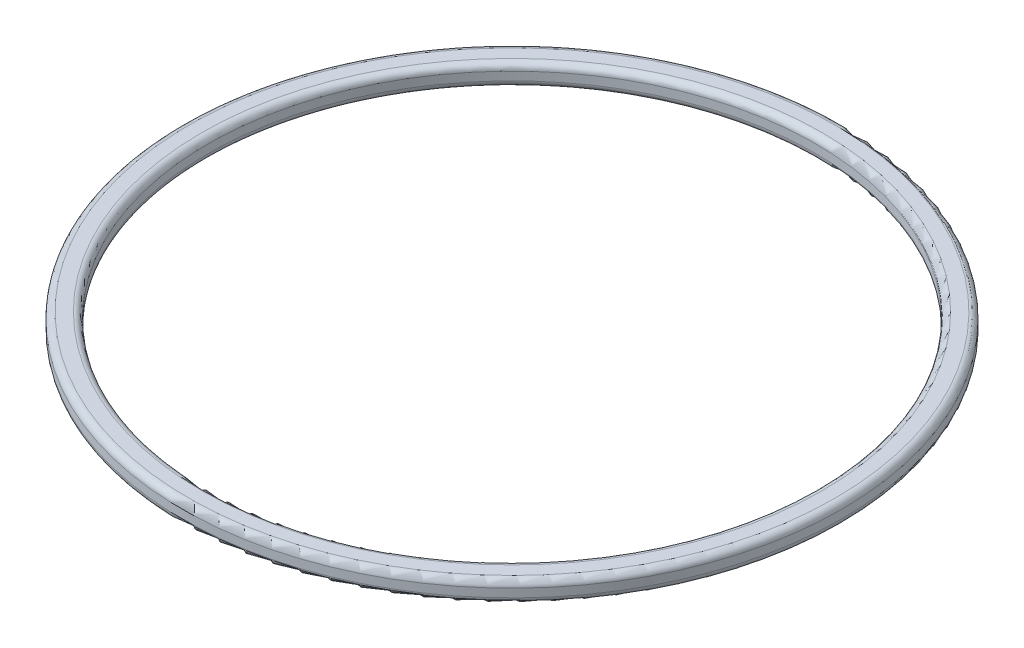
ISO-10303-21;
HEADER;
FILE_DESCRIPTION(('STEP AP214'),'2;1');
FILE_NAME('part.step','',(''),(''),'','','');
FILE_SCHEMA(('AUTOMOTIVE_DESIGN { 1 0 10303 214 1 1 1 1 }'));
ENDSEC;
DATA;
#1=APPLICATION_CONTEXT('core data for automotive mechanical design processes');
#2=APPLICATION_PROTOCOL_DEFINITION('international standard','automotive_design',2000,#1);
#3=PRODUCT_CONTEXT('',#1,'mechanical');
#4=PRODUCT('Part','Part','',(#3));
#5=PRODUCT_RELATED_PRODUCT_CATEGORY('part','',(#4));
#6=PRODUCT_DEFINITION_FORMATION('','',#4);
#7=PRODUCT_DEFINITION_CONTEXT('part definition',#1,'design');
#8=PRODUCT_DEFINITION('design','',#6,#7);
#9=PRODUCT_DEFINITION_SHAPE('','',#8);
#10=(LENGTH_UNIT() NAMED_UNIT(*) SI_UNIT(.MILLI.,.METRE.));
#11=(NAMED_UNIT(*) PLANE_ANGLE_UNIT() SI_UNIT($,.RADIAN.));
#12=(NAMED_UNIT(*) SI_UNIT($,.STERADIAN.) SOLID_ANGLE_UNIT());
#13=UNCERTAINTY_MEASURE_WITH_UNIT(LENGTH_MEASURE(1.E-05),#10,'distance_accuracy_value','');
#14=(GEOMETRIC_REPRESENTATION_CONTEXT(3) GLOBAL_UNCERTAINTY_ASSIGNED_CONTEXT((#13)) GLOBAL_UNIT_ASSIGNED_CONTEXT((#10,
#11,#12)) REPRESENTATION_CONTEXT('',''));
#15=CARTESIAN_POINT('',(0.,0.,0.));
#16=DIRECTION('',(0.,0.,1.));
#17=DIRECTION('',(1.,0.,0.));
#18=AXIS2_PLACEMENT_3D('',#15,#16,#17);
#19=CARTESIAN_POINT('',(51.,-2.3,0.));
#20=DIRECTION('',(0.,-1.,0.));
#21=DIRECTION('',(-1.,0.,0.));
#22=AXIS2_PLACEMENT_3D('',#19,#20,#21);
#23=TOROIDAL_SURFACE('',#22,50.,1.);
#24=CARTESIAN_POINT('',(51.,-3.3,0.));
#25=DIRECTION('',(0.,-1.,0.));
#26=DIRECTION('',(-1.,0.,0.));
#27=AXIS2_PLACEMENT_3D('',#24,#25,#26);
#28=CIRCLE('',#27,50.);
#29=CARTESIAN_POINT('',(101.,-3.3,0.));
#30=VERTEX_POINT('',#29);
#31=EDGE_CURVE('E28',#30,#30,#28,.T.);
#32=ORIENTED_EDGE('',*,*,#31,.F.);
#33=CARTESIAN_POINT('',(101.,-2.3,0.));
#34=DIRECTION('',(0.,0.,1.));
#35=DIRECTION('',(1.,0.,0.));
#36=AXIS2_PLACEMENT_3D('',#33,#34,#35);
#37=CIRCLE('',#36,1.);
#38=CARTESIAN_POINT('',(102.,-2.3,0.));
#39=VERTEX_POINT('',#38);
#40=EDGE_CURVE('E11',#30,#39,#37,.T.);
#41=ORIENTED_EDGE('',*,*,#40,.T.);
#42=CARTESIAN_POINT('',(51.,-2.3,0.));
#43=DIRECTION('',(0.,1.,0.));
#44=DIRECTION('',(-1.,0.,0.));
#45=AXIS2_PLACEMENT_3D('',#42,#43,#44);
#46=CIRCLE('',#45,51.);
#47=EDGE_CURVE('E66',#39,#39,#46,.T.);
#48=ORIENTED_EDGE('',*,*,#47,.F.);
#49=ORIENTED_EDGE('',*,*,#40,.F.);
#50=EDGE_LOOP('',(#32,#41,#48,#49));
#51=FACE_BOUND('',#50,.T.);
#52=ADVANCED_FACE('F17',(#51),#23,.T.);
#53=CARTESIAN_POINT('',(51.,-3.3,0.));
#54=DIRECTION('',(0.,-1.,0.));
#55=DIRECTION('',(0.,0.,-1.));
#56=AXIS2_PLACEMENT_3D('',#53,#54,#55);
#57=PLANE('',#56);
#58=CARTESIAN_POINT('',(51.,-3.3,0.));
#59=DIRECTION('',(0.,-1.,0.));
#60=DIRECTION('',(-1.,0.,0.));
#61=AXIS2_PLACEMENT_3D('',#58,#59,#60);
#62=CIRCLE('',#61,48.);
#63=CARTESIAN_POINT('',(99.,-3.3,0.));
#64=VERTEX_POINT('',#63);
#65=EDGE_CURVE('E83',#64,#64,#62,.T.);
#66=ORIENTED_EDGE('',*,*,#65,.F.);
#67=EDGE_LOOP('',(#66));
#68=FACE_BOUND('',#67,.T.);
#69=ORIENTED_EDGE('',*,*,#31,.T.);
#70=EDGE_LOOP('',(#69));
#71=FACE_BOUND('',#70,.T.);
#72=ADVANCED_FACE('F19',(#68,#71),#57,.T.);
#73=CARTESIAN_POINT('',(51.,-2.3,0.));
#74=DIRECTION('',(0.,-1.,0.));
#75=DIRECTION('',(-1.,0.,0.));
#76=AXIS2_PLACEMENT_3D('',#73,#74,#75);
#77=TOROIDAL_SURFACE('',#76,48.,1.);
#78=CARTESIAN_POINT('',(51.,-2.3,0.));
#79=DIRECTION('',(0.,-1.,0.));
#80=DIRECTION('',(-1.,0.,0.));
#81=AXIS2_PLACEMENT_3D('',#78,#79,#80);
#82=CIRCLE('',#81,47.);
#83=CARTESIAN_POINT('',(98.,-2.3,0.));
#84=VERTEX_POINT('',#83);
#85=EDGE_CURVE('E101',#84,#84,#82,.T.);
#86=ORIENTED_EDGE('',*,*,#85,.F.);
#87=CARTESIAN_POINT('',(99.,-2.3,0.));
#88=DIRECTION('',(0.,0.,1.));
#89=DIRECTION('',(1.,0.,0.));
#90=AXIS2_PLACEMENT_3D('',#87,#88,#89);
#91=CIRCLE('',#90,1.);
#92=EDGE_CURVE('E86',#84,#64,#91,.T.);
#93=ORIENTED_EDGE('',*,*,#92,.T.);
#94=ORIENTED_EDGE('',*,*,#65,.T.);
#95=ORIENTED_EDGE('',*,*,#92,.F.);
#96=EDGE_LOOP('',(#86,#93,#94,#95));
#97=FACE_BOUND('',#96,.T.);
#98=ADVANCED_FACE('F126',(#97),#77,.T.);
#99=CARTESIAN_POINT('',(51.,0.165,0.));
#100=DIRECTION('',(0.,-1.,0.));
#101=DIRECTION('',(-1.,0.,0.));
#102=AXIS2_PLACEMENT_3D('',#99,#100,#101);
#103=CYLINDRICAL_SURFACE('',#102,47.);
#104=CARTESIAN_POINT('',(51.,-1.,0.));
#105=DIRECTION('',(0.,-1.,0.));
#106=DIRECTION('',(-1.,0.,0.));
#107=AXIS2_PLACEMENT_3D('',#104,#105,#106);
#108=CIRCLE('',#107,47.);
#109=CARTESIAN_POINT('',(98.,-1.,0.));
#110=VERTEX_POINT('',#109);
#111=EDGE_CURVE('E87',#110,#110,#108,.T.);
#112=ORIENTED_EDGE('',*,*,#111,.F.);
#113=DIRECTION('',(0.,-1.,0.));
#114=VECTOR('',#113,1.);
#115=CARTESIAN_POINT('',(98.,0.165,0.));
#116=LINE('',#115,#114);
#117=EDGE_CURVE('E91',#110,#84,#116,.T.);
#118=ORIENTED_EDGE('',*,*,#117,.T.);
#119=ORIENTED_EDGE('',*,*,#85,.T.);
#120=ORIENTED_EDGE('',*,*,#117,.F.);
#121=EDGE_LOOP('',(#112,#118,#119,#120));
#122=FACE_BOUND('',#121,.T.);
#123=ADVANCED_FACE('F120',(#122),#103,.F.);
#124=CARTESIAN_POINT('',(51.,-1.,0.));
#125=DIRECTION('',(0.,-1.,0.));
#126=DIRECTION('',(-1.,0.,0.));
#127=AXIS2_PLACEMENT_3D('',#124,#125,#126);
#128=TOROIDAL_SURFACE('',#127,48.,1.);
#129=CARTESIAN_POINT('',(51.,0.,0.));
#130=DIRECTION('',(0.,-1.,0.));
#131=DIRECTION('',(-1.,0.,0.));
#132=AXIS2_PLACEMENT_3D('',#129,#130,#131);
#133=CIRCLE('',#132,48.);
#134=CARTESIAN_POINT('',(99.,0.,0.));
#135=VERTEX_POINT('',#134);
#136=EDGE_CURVE('E93',#135,#135,#133,.T.);
#137=ORIENTED_EDGE('',*,*,#136,.F.);
#138=CARTESIAN_POINT('',(99.,-1.,0.));
#139=DIRECTION('',(0.,0.,1.));
#140=DIRECTION('',(1.,0.,0.));
#141=AXIS2_PLACEMENT_3D('',#138,#139,#140);
#142=CIRCLE('',#141,1.);
#143=EDGE_CURVE('E92',#135,#110,#142,.T.);
#144=ORIENTED_EDGE('',*,*,#143,.T.);
#145=ORIENTED_EDGE('',*,*,#111,.T.);
#146=ORIENTED_EDGE('',*,*,#143,.F.);
#147=EDGE_LOOP('',(#137,#144,#145,#146));
#148=FACE_BOUND('',#147,.T.);
#149=ADVANCED_FACE('F141',(#148),#128,.T.);
#150=CARTESIAN_POINT('',(51.,0.,0.));
#151=DIRECTION('',(0.,-1.,0.));
#152=DIRECTION('',(0.,0.,-1.));
#153=AXIS2_PLACEMENT_3D('',#150,#151,#152);
#154=PLANE('',#153);
#155=ORIENTED_EDGE('',*,*,#136,.T.);
#156=EDGE_LOOP('',(#155));
#157=FACE_BOUND('',#156,.T.);
#158=CARTESIAN_POINT('',(51.,0.,0.));
#159=DIRECTION('',(0.,1.,0.));
#160=DIRECTION('',(-1.,0.,0.));
#161=AXIS2_PLACEMENT_3D('',#158,#159,#160);
#162=CIRCLE('',#161,50.);
#163=CARTESIAN_POINT('',(101.,0.,0.));
#164=VERTEX_POINT('',#163);
#165=EDGE_CURVE('E97',#164,#164,#162,.T.);
#166=ORIENTED_EDGE('',*,*,#165,.T.);
#167=EDGE_LOOP('',(#166));
#168=FACE_BOUND('',#167,.T.);
#169=ADVANCED_FACE('F148',(#157,#168),#154,.F.);
#170=CARTESIAN_POINT('',(51.,-1.,0.));
#171=DIRECTION('',(0.,-1.,0.));
#172=DIRECTION('',(-1.,0.,0.));
#173=AXIS2_PLACEMENT_3D('',#170,#171,#172);
#174=TOROIDAL_SURFACE('',#173,50.,1.);
#175=CARTESIAN_POINT('',(51.,-1.,0.));
#176=DIRECTION('',(0.,-1.,0.));
#177=DIRECTION('',(-1.,0.,0.));
#178=AXIS2_PLACEMENT_3D('',#175,#176,#177);
#179=CIRCLE('',#178,51.);
#180=CARTESIAN_POINT('',(102.,-1.,0.));
#181=VERTEX_POINT('',#180);
#182=EDGE_CURVE('E70',#181,#181,#179,.T.);
#183=ORIENTED_EDGE('',*,*,#182,.F.);
#184=CARTESIAN_POINT('',(101.,-1.,0.));
#185=DIRECTION('',(0.,0.,1.));
#186=DIRECTION('',(1.,0.,0.));
#187=AXIS2_PLACEMENT_3D('',#184,#185,#186);
#188=CIRCLE('',#187,1.);
#189=EDGE_CURVE('E57',#181,#164,#188,.T.);
#190=ORIENTED_EDGE('',*,*,#189,.T.);
#191=ORIENTED_EDGE('',*,*,#165,.F.);
#192=ORIENTED_EDGE('',*,*,#189,.F.);
#193=EDGE_LOOP('',(#183,#190,#191,#192));
#194=FACE_BOUND('',#193,.T.);
#195=ADVANCED_FACE('F145',(#194),#174,.T.);
#196=CARTESIAN_POINT('',(51.,0.165,0.));
#197=DIRECTION('',(0.,-1.,0.));
#198=DIRECTION('',(-1.,0.,0.));
#199=AXIS2_PLACEMENT_3D('',#196,#197,#198);
#200=CYLINDRICAL_SURFACE('',#199,51.);
#201=ORIENTED_EDGE('',*,*,#47,.T.);
#202=DIRECTION('',(0.,1.,0.));
#203=VECTOR('',#202,1.);
#204=CARTESIAN_POINT('',(102.,0.165,0.));
#205=LINE('',#204,#203);
#206=EDGE_CURVE('E21',#39,#181,#205,.T.);
#207=ORIENTED_EDGE('',*,*,#206,.T.);
#208=ORIENTED_EDGE('',*,*,#182,.T.);
#209=ORIENTED_EDGE('',*,*,#206,.F.);
#210=EDGE_LOOP('',(#201,#207,#208,#209));
#211=FACE_BOUND('',#210,.T.);
#212=ADVANCED_FACE('F69',(#211),#200,.T.);
#213=CLOSED_SHELL('',(#52,#72,#98,#123,#149,#169,#195,#212));
#214=MANIFOLD_SOLID_BREP('B1',#213);
#215=ADVANCED_BREP_SHAPE_REPRESENTATION('',(#18,#214),#14);
#216=SHAPE_DEFINITION_REPRESENTATION(#9,#215);
ENDSEC;
END-ISO-10303-21;
